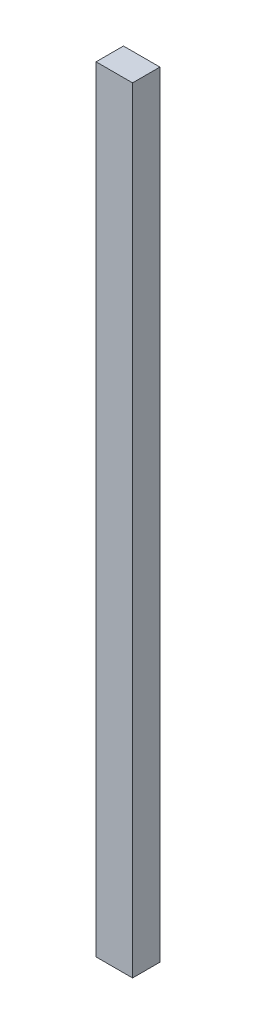
ISO-10303-21;
HEADER;
FILE_DESCRIPTION(('STEP AP214'),'2;1');
FILE_NAME('part.step','',(''),(''),'','','');
FILE_SCHEMA(('AUTOMOTIVE_DESIGN { 1 0 10303 214 1 1 1 1 }'));
ENDSEC;
DATA;
#1=APPLICATION_CONTEXT('core data for automotive mechanical design processes');
#2=APPLICATION_PROTOCOL_DEFINITION('international standard','automotive_design',2000,#1);
#3=PRODUCT_CONTEXT('',#1,'mechanical');
#4=PRODUCT('Part','Part','',(#3));
#5=PRODUCT_RELATED_PRODUCT_CATEGORY('part','',(#4));
#6=PRODUCT_DEFINITION_FORMATION('','',#4);
#7=PRODUCT_DEFINITION_CONTEXT('part definition',#1,'design');
#8=PRODUCT_DEFINITION('design','',#6,#7);
#9=PRODUCT_DEFINITION_SHAPE('','',#8);
#10=(LENGTH_UNIT() NAMED_UNIT(*) SI_UNIT(.MILLI.,.METRE.));
#11=(NAMED_UNIT(*) PLANE_ANGLE_UNIT() SI_UNIT($,.RADIAN.));
#12=(NAMED_UNIT(*) SI_UNIT($,.STERADIAN.) SOLID_ANGLE_UNIT());
#13=UNCERTAINTY_MEASURE_WITH_UNIT(LENGTH_MEASURE(1.E-05),#10,'distance_accuracy_value','');
#14=(GEOMETRIC_REPRESENTATION_CONTEXT(3) GLOBAL_UNCERTAINTY_ASSIGNED_CONTEXT((#13)) GLOBAL_UNIT_ASSIGNED_CONTEXT((#10,
#11,#12)) REPRESENTATION_CONTEXT('',''));
#15=CARTESIAN_POINT('',(0.,0.,0.));
#16=DIRECTION('',(0.,0.,1.));
#17=DIRECTION('',(1.,0.,0.));
#18=AXIS2_PLACEMENT_3D('',#15,#16,#17);
#19=CARTESIAN_POINT('',(0.,0.,3.));
#20=DIRECTION('',(1.,0.,0.));
#21=DIRECTION('',(0.,0.,-1.));
#22=AXIS2_PLACEMENT_3D('',#19,#20,#21);
#23=PLANE('',#22);
#24=DIRECTION('',(0.,-1.,0.));
#25=VECTOR('',#24,1.);
#26=CARTESIAN_POINT('',(0.,0.,0.));
#27=LINE('',#26,#25);
#28=CARTESIAN_POINT('',(0.,85.,0.));
#29=VERTEX_POINT('',#28);
#30=CARTESIAN_POINT('',(0.,0.,0.));
#31=VERTEX_POINT('',#30);
#32=EDGE_CURVE('E96',#29,#31,#27,.T.);
#33=ORIENTED_EDGE('',*,*,#32,.T.);
#34=DIRECTION('',(0.,0.,-1.));
#35=VECTOR('',#34,1.);
#36=CARTESIAN_POINT('',(0.,0.,3.));
#37=LINE('',#36,#35);
#38=CARTESIAN_POINT('',(0.,0.,3.));
#39=VERTEX_POINT('',#38);
#40=EDGE_CURVE('E11',#39,#31,#37,.T.);
#41=ORIENTED_EDGE('',*,*,#40,.F.);
#42=DIRECTION('',(0.,-1.,0.));
#43=VECTOR('',#42,1.);
#44=CARTESIAN_POINT('',(0.,0.,3.));
#45=LINE('',#44,#43);
#46=CARTESIAN_POINT('',(0.,85.,3.));
#47=VERTEX_POINT('',#46);
#48=EDGE_CURVE('E84',#47,#39,#45,.T.);
#49=ORIENTED_EDGE('',*,*,#48,.F.);
#50=DIRECTION('',(0.,0.,-1.));
#51=VECTOR('',#50,1.);
#52=CARTESIAN_POINT('',(0.,85.,3.));
#53=LINE('',#52,#51);
#54=EDGE_CURVE('E92',#47,#29,#53,.T.);
#55=ORIENTED_EDGE('',*,*,#54,.T.);
#56=EDGE_LOOP('',(#33,#41,#49,#55));
#57=FACE_BOUND('',#56,.T.);
#58=ADVANCED_FACE('F33',(#57),#23,.F.);
#59=CARTESIAN_POINT('',(0.,0.,3.));
#60=DIRECTION('',(0.,1.,0.));
#61=DIRECTION('',(0.,0.,1.));
#62=AXIS2_PLACEMENT_3D('',#59,#60,#61);
#63=PLANE('',#62);
#64=DIRECTION('',(1.,0.,0.));
#65=VECTOR('',#64,1.);
#66=CARTESIAN_POINT('',(0.,0.,0.));
#67=LINE('',#66,#65);
#68=CARTESIAN_POINT('',(4.,0.,0.));
#69=VERTEX_POINT('',#68);
#70=EDGE_CURVE('E88',#31,#69,#67,.T.);
#71=ORIENTED_EDGE('',*,*,#70,.T.);
#72=DIRECTION('',(0.,0.,-1.));
#73=VECTOR('',#72,1.);
#74=CARTESIAN_POINT('',(4.,0.,3.));
#75=LINE('',#74,#73);
#76=CARTESIAN_POINT('',(4.,0.,3.));
#77=VERTEX_POINT('',#76);
#78=EDGE_CURVE('E41',#77,#69,#75,.T.);
#79=ORIENTED_EDGE('',*,*,#78,.F.);
#80=DIRECTION('',(1.,0.,0.));
#81=VECTOR('',#80,1.);
#82=CARTESIAN_POINT('',(0.,0.,3.));
#83=LINE('',#82,#81);
#84=EDGE_CURVE('E79',#39,#77,#83,.T.);
#85=ORIENTED_EDGE('',*,*,#84,.F.);
#86=ORIENTED_EDGE('',*,*,#40,.T.);
#87=EDGE_LOOP('',(#71,#79,#85,#86));
#88=FACE_BOUND('',#87,.T.);
#89=ADVANCED_FACE('F87',(#88),#63,.F.);
#90=CARTESIAN_POINT('',(4.,0.,3.));
#91=DIRECTION('',(-1.,0.,0.));
#92=DIRECTION('',(0.,0.,1.));
#93=AXIS2_PLACEMENT_3D('',#90,#91,#92);
#94=PLANE('',#93);
#95=DIRECTION('',(0.,1.,0.));
#96=VECTOR('',#95,1.);
#97=CARTESIAN_POINT('',(4.,0.,0.));
#98=LINE('',#97,#96);
#99=CARTESIAN_POINT('',(4.,85.,0.));
#100=VERTEX_POINT('',#99);
#101=EDGE_CURVE('E66',#69,#100,#98,.T.);
#102=ORIENTED_EDGE('',*,*,#101,.T.);
#103=DIRECTION('',(0.,0.,-1.));
#104=VECTOR('',#103,1.);
#105=CARTESIAN_POINT('',(4.,85.,3.));
#106=LINE('',#105,#104);
#107=CARTESIAN_POINT('',(4.,85.,3.));
#108=VERTEX_POINT('',#107);
#109=EDGE_CURVE('E89',#108,#100,#106,.T.);
#110=ORIENTED_EDGE('',*,*,#109,.F.);
#111=DIRECTION('',(0.,1.,0.));
#112=VECTOR('',#111,1.);
#113=CARTESIAN_POINT('',(4.,0.,3.));
#114=LINE('',#113,#112);
#115=EDGE_CURVE('E82',#77,#108,#114,.T.);
#116=ORIENTED_EDGE('',*,*,#115,.F.);
#117=ORIENTED_EDGE('',*,*,#78,.T.);
#118=EDGE_LOOP('',(#102,#110,#116,#117));
#119=FACE_BOUND('',#118,.T.);
#120=ADVANCED_FACE('F90',(#119),#94,.F.);
#121=CARTESIAN_POINT('',(0.,85.,3.));
#122=DIRECTION('',(0.,-1.,0.));
#123=DIRECTION('',(0.,0.,-1.));
#124=AXIS2_PLACEMENT_3D('',#121,#122,#123);
#125=PLANE('',#124);
#126=DIRECTION('',(-1.,0.,0.));
#127=VECTOR('',#126,1.);
#128=CARTESIAN_POINT('',(0.,85.,0.));
#129=LINE('',#128,#127);
#130=EDGE_CURVE('E72',#100,#29,#129,.T.);
#131=ORIENTED_EDGE('',*,*,#130,.T.);
#132=ORIENTED_EDGE('',*,*,#54,.F.);
#133=DIRECTION('',(-1.,0.,0.));
#134=VECTOR('',#133,1.);
#135=CARTESIAN_POINT('',(0.,85.,3.));
#136=LINE('',#135,#134);
#137=EDGE_CURVE('E49',#108,#47,#136,.T.);
#138=ORIENTED_EDGE('',*,*,#137,.F.);
#139=ORIENTED_EDGE('',*,*,#109,.T.);
#140=EDGE_LOOP('',(#131,#132,#138,#139));
#141=FACE_BOUND('',#140,.T.);
#142=ADVANCED_FACE('F103',(#141),#125,.F.);
#143=CARTESIAN_POINT('',(0.,0.,3.));
#144=DIRECTION('',(0.,0.,-1.));
#145=DIRECTION('',(-1.,0.,0.));
#146=AXIS2_PLACEMENT_3D('',#143,#144,#145);
#147=PLANE('',#146);
#148=ORIENTED_EDGE('',*,*,#48,.T.);
#149=ORIENTED_EDGE('',*,*,#84,.T.);
#150=ORIENTED_EDGE('',*,*,#115,.T.);
#151=ORIENTED_EDGE('',*,*,#137,.T.);
#152=EDGE_LOOP('',(#148,#149,#150,#151));
#153=FACE_BOUND('',#152,.T.);
#154=ADVANCED_FACE('F80',(#153),#147,.F.);
#155=CARTESIAN_POINT('',(0.,0.,0.));
#156=DIRECTION('',(0.,0.,-1.));
#157=DIRECTION('',(-1.,0.,0.));
#158=AXIS2_PLACEMENT_3D('',#155,#156,#157);
#159=PLANE('',#158);
#160=ORIENTED_EDGE('',*,*,#32,.F.);
#161=ORIENTED_EDGE('',*,*,#130,.F.);
#162=ORIENTED_EDGE('',*,*,#101,.F.);
#163=ORIENTED_EDGE('',*,*,#70,.F.);
#164=EDGE_LOOP('',(#160,#161,#162,#163));
#165=FACE_BOUND('',#164,.T.);
#166=ADVANCED_FACE('F106',(#165),#159,.T.);
#167=CLOSED_SHELL('',(#58,#89,#120,#142,#154,#166));
#168=MANIFOLD_SOLID_BREP('B2',#167);
#169=ADVANCED_BREP_SHAPE_REPRESENTATION('',(#18,#168),#14);
#170=SHAPE_DEFINITION_REPRESENTATION(#9,#169);
ENDSEC;
END-ISO-10303-21;
